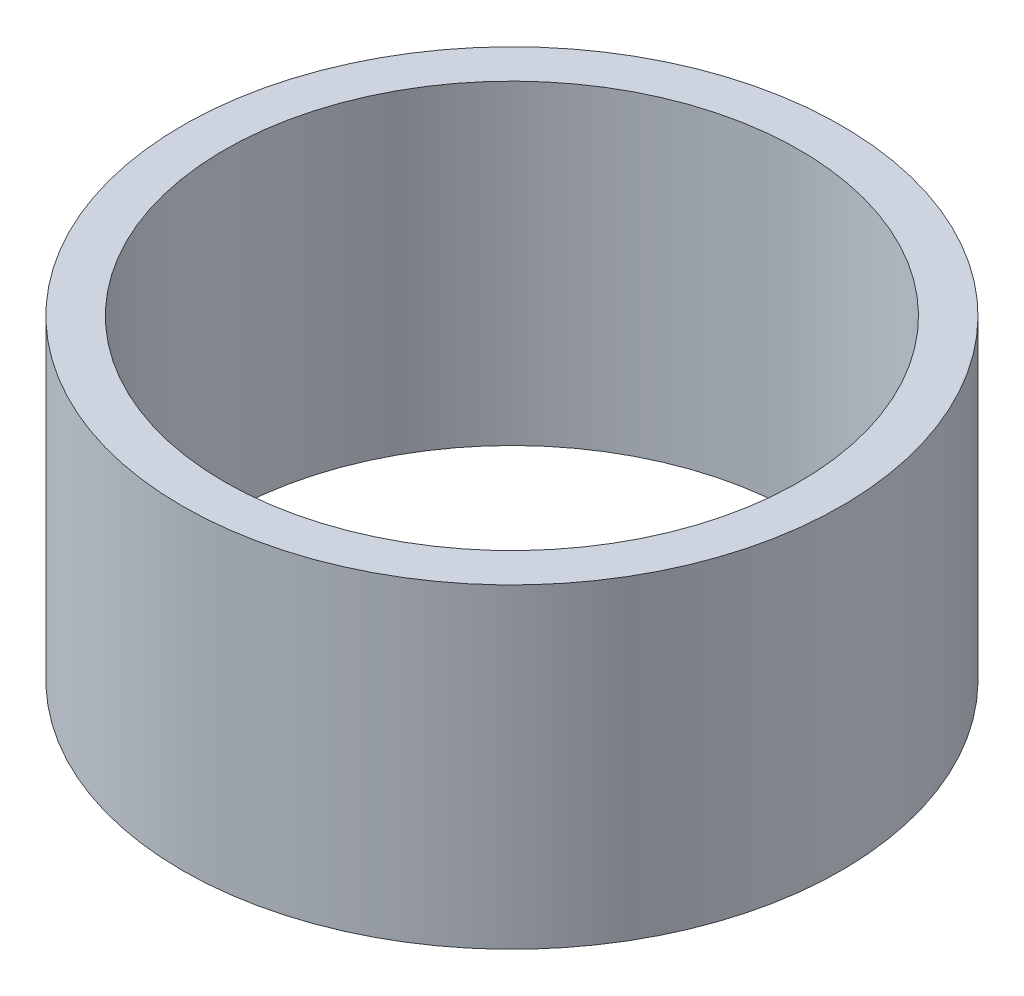
ISO-10303-21;
HEADER;
FILE_DESCRIPTION(('STEP AP214'),'2;1');
FILE_NAME('part.step','',(''),(''),'','','');
FILE_SCHEMA(('AUTOMOTIVE_DESIGN { 1 0 10303 214 1 1 1 1 }'));
ENDSEC;
DATA;
#1=APPLICATION_CONTEXT('core data for automotive mechanical design processes');
#2=APPLICATION_PROTOCOL_DEFINITION('international standard','automotive_design',2000,#1);
#3=PRODUCT_CONTEXT('',#1,'mechanical');
#4=PRODUCT('Part','Part','',(#3));
#5=PRODUCT_RELATED_PRODUCT_CATEGORY('part','',(#4));
#6=PRODUCT_DEFINITION_FORMATION('','',#4);
#7=PRODUCT_DEFINITION_CONTEXT('part definition',#1,'design');
#8=PRODUCT_DEFINITION('design','',#6,#7);
#9=PRODUCT_DEFINITION_SHAPE('','',#8);
#10=(LENGTH_UNIT() NAMED_UNIT(*) SI_UNIT(.MILLI.,.METRE.));
#11=(NAMED_UNIT(*) PLANE_ANGLE_UNIT() SI_UNIT($,.RADIAN.));
#12=(NAMED_UNIT(*) SI_UNIT($,.STERADIAN.) SOLID_ANGLE_UNIT());
#13=UNCERTAINTY_MEASURE_WITH_UNIT(LENGTH_MEASURE(1.E-05),#10,'distance_accuracy_value','');
#14=(GEOMETRIC_REPRESENTATION_CONTEXT(3) GLOBAL_UNCERTAINTY_ASSIGNED_CONTEXT((#13)) GLOBAL_UNIT_ASSIGNED_CONTEXT((#10,
#11,#12)) REPRESENTATION_CONTEXT('',''));
#15=CARTESIAN_POINT('',(0.,0.,0.));
#16=DIRECTION('',(0.,0.,1.));
#17=DIRECTION('',(1.,0.,0.));
#18=AXIS2_PLACEMENT_3D('',#15,#16,#17);
#19=CARTESIAN_POINT('',(0.,28.120065129278,0.));
#20=DIRECTION('',(0.,1.,0.));
#21=DIRECTION('',(0.,0.,1.));
#22=AXIS2_PLACEMENT_3D('',#19,#20,#21);
#23=CYLINDRICAL_SURFACE('',#22,20.5);
#24=CARTESIAN_POINT('',(0.,0.,0.));
#25=DIRECTION('',(0.,1.,0.));
#26=DIRECTION('',(0.,0.,1.));
#27=AXIS2_PLACEMENT_3D('',#24,#25,#26);
#28=CIRCLE('',#27,20.5);
#29=CARTESIAN_POINT('',(0.,0.,20.5));
#30=VERTEX_POINT('',#29);
#31=EDGE_CURVE('E10',#30,#30,#28,.T.);
#32=ORIENTED_EDGE('',*,*,#31,.F.);
#33=EDGE_LOOP('',(#32));
#34=FACE_BOUND('',#33,.T.);
#35=CARTESIAN_POINT('',(0.,22.5,0.));
#36=DIRECTION('',(0.,1.,0.));
#37=DIRECTION('',(0.,0.,1.));
#38=AXIS2_PLACEMENT_3D('',#35,#36,#37);
#39=CIRCLE('',#38,20.5);
#40=CARTESIAN_POINT('',(0.,22.5,20.5));
#41=VERTEX_POINT('',#40);
#42=EDGE_CURVE('E46',#41,#41,#39,.T.);
#43=ORIENTED_EDGE('',*,*,#42,.T.);
#44=EDGE_LOOP('',(#43));
#45=FACE_BOUND('',#44,.T.);
#46=ADVANCED_FACE('F32',(#34,#45),#23,.F.);
#47=CARTESIAN_POINT('',(20.5,0.,0.));
#48=DIRECTION('',(0.,1.,0.));
#49=DIRECTION('',(0.,0.,1.));
#50=AXIS2_PLACEMENT_3D('',#47,#48,#49);
#51=PLANE('',#50);
#52=CARTESIAN_POINT('',(0.,0.,0.));
#53=DIRECTION('',(0.,1.,0.));
#54=DIRECTION('',(0.,0.,1.));
#55=AXIS2_PLACEMENT_3D('',#52,#53,#54);
#56=CIRCLE('',#55,23.5);
#57=CARTESIAN_POINT('',(0.,0.,23.5));
#58=VERTEX_POINT('',#57);
#59=EDGE_CURVE('E38',#58,#58,#56,.T.);
#60=ORIENTED_EDGE('',*,*,#59,.F.);
#61=EDGE_LOOP('',(#60));
#62=FACE_BOUND('',#61,.T.);
#63=ORIENTED_EDGE('',*,*,#31,.T.);
#64=EDGE_LOOP('',(#63));
#65=FACE_BOUND('',#64,.T.);
#66=ADVANCED_FACE('F61',(#62,#65),#51,.F.);
#67=CARTESIAN_POINT('',(0.,28.120065129278,0.));
#68=DIRECTION('',(0.,1.,0.));
#69=DIRECTION('',(0.,0.,1.));
#70=AXIS2_PLACEMENT_3D('',#67,#68,#69);
#71=CYLINDRICAL_SURFACE('',#70,23.5);
#72=CARTESIAN_POINT('',(0.,22.5,0.));
#73=DIRECTION('',(0.,1.,0.));
#74=DIRECTION('',(0.,0.,1.));
#75=AXIS2_PLACEMENT_3D('',#72,#73,#74);
#76=CIRCLE('',#75,23.5);
#77=CARTESIAN_POINT('',(0.,22.5,23.5));
#78=VERTEX_POINT('',#77);
#79=EDGE_CURVE('E42',#78,#78,#76,.T.);
#80=ORIENTED_EDGE('',*,*,#79,.F.);
#81=EDGE_LOOP('',(#80));
#82=FACE_BOUND('',#81,.T.);
#83=ORIENTED_EDGE('',*,*,#59,.T.);
#84=EDGE_LOOP('',(#83));
#85=FACE_BOUND('',#84,.T.);
#86=ADVANCED_FACE('F56',(#82,#85),#71,.T.);
#87=CARTESIAN_POINT('',(20.5,22.5,0.));
#88=DIRECTION('',(0.,-1.,0.));
#89=DIRECTION('',(0.,0.,-1.));
#90=AXIS2_PLACEMENT_3D('',#87,#88,#89);
#91=PLANE('',#90);
#92=ORIENTED_EDGE('',*,*,#42,.F.);
#93=EDGE_LOOP('',(#92));
#94=FACE_BOUND('',#93,.T.);
#95=ORIENTED_EDGE('',*,*,#79,.T.);
#96=EDGE_LOOP('',(#95));
#97=FACE_BOUND('',#96,.T.);
#98=ADVANCED_FACE('F53',(#94,#97),#91,.F.);
#99=CLOSED_SHELL('',(#46,#66,#86,#98));
#100=MANIFOLD_SOLID_BREP('B2',#99);
#101=ADVANCED_BREP_SHAPE_REPRESENTATION('',(#18,#100),#14);
#102=SHAPE_DEFINITION_REPRESENTATION(#9,#101);
ENDSEC;
END-ISO-10303-21;
